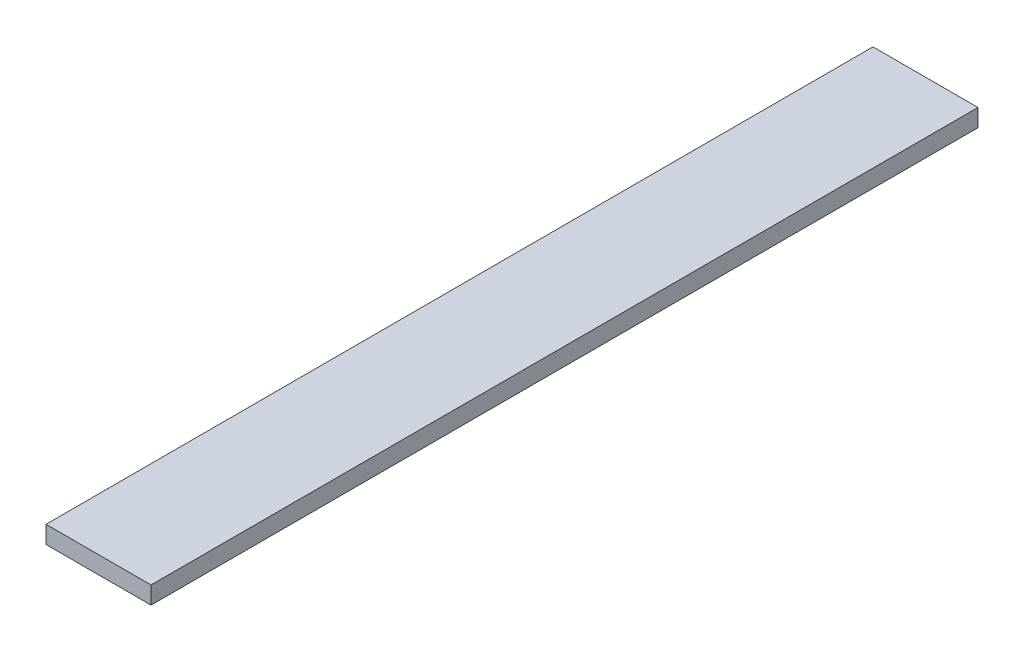
ISO-10303-21;
HEADER;
FILE_DESCRIPTION(('STEP AP214'),'2;1');
FILE_NAME('part.step','',(''),(''),'','','');
FILE_SCHEMA(('AUTOMOTIVE_DESIGN { 1 0 10303 214 1 1 1 1 }'));
ENDSEC;
DATA;
#1=APPLICATION_CONTEXT('core data for automotive mechanical design processes');
#2=APPLICATION_PROTOCOL_DEFINITION('international standard','automotive_design',2000,#1);
#3=PRODUCT_CONTEXT('',#1,'mechanical');
#4=PRODUCT('Part','Part','',(#3));
#5=PRODUCT_RELATED_PRODUCT_CATEGORY('part','',(#4));
#6=PRODUCT_DEFINITION_FORMATION('','',#4);
#7=PRODUCT_DEFINITION_CONTEXT('part definition',#1,'design');
#8=PRODUCT_DEFINITION('design','',#6,#7);
#9=PRODUCT_DEFINITION_SHAPE('','',#8);
#10=(LENGTH_UNIT() NAMED_UNIT(*) SI_UNIT(.MILLI.,.METRE.));
#11=(NAMED_UNIT(*) PLANE_ANGLE_UNIT() SI_UNIT($,.RADIAN.));
#12=(NAMED_UNIT(*) SI_UNIT($,.STERADIAN.) SOLID_ANGLE_UNIT());
#13=UNCERTAINTY_MEASURE_WITH_UNIT(LENGTH_MEASURE(1.E-05),#10,'distance_accuracy_value','');
#14=(GEOMETRIC_REPRESENTATION_CONTEXT(3) GLOBAL_UNCERTAINTY_ASSIGNED_CONTEXT((#13)) GLOBAL_UNIT_ASSIGNED_CONTEXT((#10,
#11,#12)) REPRESENTATION_CONTEXT('',''));
#15=CARTESIAN_POINT('',(0.,0.,0.));
#16=DIRECTION('',(0.,0.,1.));
#17=DIRECTION('',(1.,0.,0.));
#18=AXIS2_PLACEMENT_3D('',#15,#16,#17);
#19=CARTESIAN_POINT('',(-38.1,-6.35,600.));
#20=DIRECTION('',(1.,0.,0.));
#21=DIRECTION('',(0.,0.,-1.));
#22=AXIS2_PLACEMENT_3D('',#19,#20,#21);
#23=PLANE('',#22);
#24=DIRECTION('',(0.,-1.,0.));
#25=VECTOR('',#24,1.);
#26=CARTESIAN_POINT('',(-38.1,-6.35,0.));
#27=LINE('',#26,#25);
#28=CARTESIAN_POINT('',(-38.1,6.35,0.));
#29=VERTEX_POINT('',#28);
#30=CARTESIAN_POINT('',(-38.1,-6.35,0.));
#31=VERTEX_POINT('',#30);
#32=EDGE_CURVE('E96',#29,#31,#27,.T.);
#33=ORIENTED_EDGE('',*,*,#32,.T.);
#34=DIRECTION('',(0.,0.,-1.));
#35=VECTOR('',#34,1.);
#36=CARTESIAN_POINT('',(-38.1,-6.35,600.));
#37=LINE('',#36,#35);
#38=CARTESIAN_POINT('',(-38.1,-6.35,600.));
#39=VERTEX_POINT('',#38);
#40=EDGE_CURVE('E11',#39,#31,#37,.T.);
#41=ORIENTED_EDGE('',*,*,#40,.F.);
#42=DIRECTION('',(0.,-1.,0.));
#43=VECTOR('',#42,1.);
#44=CARTESIAN_POINT('',(-38.1,-6.35,600.));
#45=LINE('',#44,#43);
#46=CARTESIAN_POINT('',(-38.1,6.35,600.));
#47=VERTEX_POINT('',#46);
#48=EDGE_CURVE('E84',#47,#39,#45,.T.);
#49=ORIENTED_EDGE('',*,*,#48,.F.);
#50=DIRECTION('',(0.,0.,-1.));
#51=VECTOR('',#50,1.);
#52=CARTESIAN_POINT('',(-38.1,6.35,600.));
#53=LINE('',#52,#51);
#54=EDGE_CURVE('E92',#47,#29,#53,.T.);
#55=ORIENTED_EDGE('',*,*,#54,.T.);
#56=EDGE_LOOP('',(#33,#41,#49,#55));
#57=FACE_BOUND('',#56,.T.);
#58=ADVANCED_FACE('F33',(#57),#23,.F.);
#59=CARTESIAN_POINT('',(38.1,-6.35,600.));
#60=DIRECTION('',(0.,1.,0.));
#61=DIRECTION('',(0.,0.,1.));
#62=AXIS2_PLACEMENT_3D('',#59,#60,#61);
#63=PLANE('',#62);
#64=DIRECTION('',(1.,0.,0.));
#65=VECTOR('',#64,1.);
#66=CARTESIAN_POINT('',(38.1,-6.35,0.));
#67=LINE('',#66,#65);
#68=CARTESIAN_POINT('',(38.1,-6.35,0.));
#69=VERTEX_POINT('',#68);
#70=EDGE_CURVE('E88',#31,#69,#67,.T.);
#71=ORIENTED_EDGE('',*,*,#70,.T.);
#72=DIRECTION('',(0.,0.,-1.));
#73=VECTOR('',#72,1.);
#74=CARTESIAN_POINT('',(38.1,-6.35,600.));
#75=LINE('',#74,#73);
#76=CARTESIAN_POINT('',(38.1,-6.35,600.));
#77=VERTEX_POINT('',#76);
#78=EDGE_CURVE('E41',#77,#69,#75,.T.);
#79=ORIENTED_EDGE('',*,*,#78,.F.);
#80=DIRECTION('',(1.,0.,0.));
#81=VECTOR('',#80,1.);
#82=CARTESIAN_POINT('',(38.1,-6.35,600.));
#83=LINE('',#82,#81);
#84=EDGE_CURVE('E79',#39,#77,#83,.T.);
#85=ORIENTED_EDGE('',*,*,#84,.F.);
#86=ORIENTED_EDGE('',*,*,#40,.T.);
#87=EDGE_LOOP('',(#71,#79,#85,#86));
#88=FACE_BOUND('',#87,.T.);
#89=ADVANCED_FACE('F87',(#88),#63,.F.);
#90=CARTESIAN_POINT('',(38.1,-6.35,600.));
#91=DIRECTION('',(-1.,0.,0.));
#92=DIRECTION('',(0.,-1.,0.));
#93=AXIS2_PLACEMENT_3D('',#90,#91,#92);
#94=PLANE('',#93);
#95=DIRECTION('',(0.,1.,0.));
#96=VECTOR('',#95,1.);
#97=CARTESIAN_POINT('',(38.1,-6.35,0.));
#98=LINE('',#97,#96);
#99=CARTESIAN_POINT('',(38.1,6.35,0.));
#100=VERTEX_POINT('',#99);
#101=EDGE_CURVE('E66',#69,#100,#98,.T.);
#102=ORIENTED_EDGE('',*,*,#101,.T.);
#103=DIRECTION('',(0.,0.,-1.));
#104=VECTOR('',#103,1.);
#105=CARTESIAN_POINT('',(38.1,6.35,600.));
#106=LINE('',#105,#104);
#107=CARTESIAN_POINT('',(38.1,6.35,600.));
#108=VERTEX_POINT('',#107);
#109=EDGE_CURVE('E89',#108,#100,#106,.T.);
#110=ORIENTED_EDGE('',*,*,#109,.F.);
#111=DIRECTION('',(0.,1.,0.));
#112=VECTOR('',#111,1.);
#113=CARTESIAN_POINT('',(38.1,-6.35,600.));
#114=LINE('',#113,#112);
#115=EDGE_CURVE('E82',#77,#108,#114,.T.);
#116=ORIENTED_EDGE('',*,*,#115,.F.);
#117=ORIENTED_EDGE('',*,*,#78,.T.);
#118=EDGE_LOOP('',(#102,#110,#116,#117));
#119=FACE_BOUND('',#118,.T.);
#120=ADVANCED_FACE('F90',(#119),#94,.F.);
#121=CARTESIAN_POINT('',(38.1,6.35,600.));
#122=DIRECTION('',(0.,-1.,0.));
#123=DIRECTION('',(0.,0.,-1.));
#124=AXIS2_PLACEMENT_3D('',#121,#122,#123);
#125=PLANE('',#124);
#126=DIRECTION('',(-1.,0.,0.));
#127=VECTOR('',#126,1.);
#128=CARTESIAN_POINT('',(38.1,6.35,0.));
#129=LINE('',#128,#127);
#130=EDGE_CURVE('E72',#100,#29,#129,.T.);
#131=ORIENTED_EDGE('',*,*,#130,.T.);
#132=ORIENTED_EDGE('',*,*,#54,.F.);
#133=DIRECTION('',(-1.,0.,0.));
#134=VECTOR('',#133,1.);
#135=CARTESIAN_POINT('',(38.1,6.35,600.));
#136=LINE('',#135,#134);
#137=EDGE_CURVE('E49',#108,#47,#136,.T.);
#138=ORIENTED_EDGE('',*,*,#137,.F.);
#139=ORIENTED_EDGE('',*,*,#109,.T.);
#140=EDGE_LOOP('',(#131,#132,#138,#139));
#141=FACE_BOUND('',#140,.T.);
#142=ADVANCED_FACE('F103',(#141),#125,.F.);
#143=CARTESIAN_POINT('',(0.,0.,600.));
#144=DIRECTION('',(0.,0.,1.));
#145=DIRECTION('',(1.,0.,0.));
#146=AXIS2_PLACEMENT_3D('',#143,#144,#145);
#147=PLANE('',#146);
#148=ORIENTED_EDGE('',*,*,#48,.T.);
#149=ORIENTED_EDGE('',*,*,#84,.T.);
#150=ORIENTED_EDGE('',*,*,#115,.T.);
#151=ORIENTED_EDGE('',*,*,#137,.T.);
#152=EDGE_LOOP('',(#148,#149,#150,#151));
#153=FACE_BOUND('',#152,.T.);
#154=ADVANCED_FACE('F80',(#153),#147,.T.);
#155=CARTESIAN_POINT('',(0.,0.,0.));
#156=DIRECTION('',(0.,0.,1.));
#157=DIRECTION('',(1.,0.,0.));
#158=AXIS2_PLACEMENT_3D('',#155,#156,#157);
#159=PLANE('',#158);
#160=ORIENTED_EDGE('',*,*,#32,.F.);
#161=ORIENTED_EDGE('',*,*,#130,.F.);
#162=ORIENTED_EDGE('',*,*,#101,.F.);
#163=ORIENTED_EDGE('',*,*,#70,.F.);
#164=EDGE_LOOP('',(#160,#161,#162,#163));
#165=FACE_BOUND('',#164,.T.);
#166=ADVANCED_FACE('F106',(#165),#159,.F.);
#167=CLOSED_SHELL('',(#58,#89,#120,#142,#154,#166));
#168=MANIFOLD_SOLID_BREP('B2',#167);
#169=ADVANCED_BREP_SHAPE_REPRESENTATION('',(#18,#168),#14);
#170=SHAPE_DEFINITION_REPRESENTATION(#9,#169);
ENDSEC;
END-ISO-10303-21;
